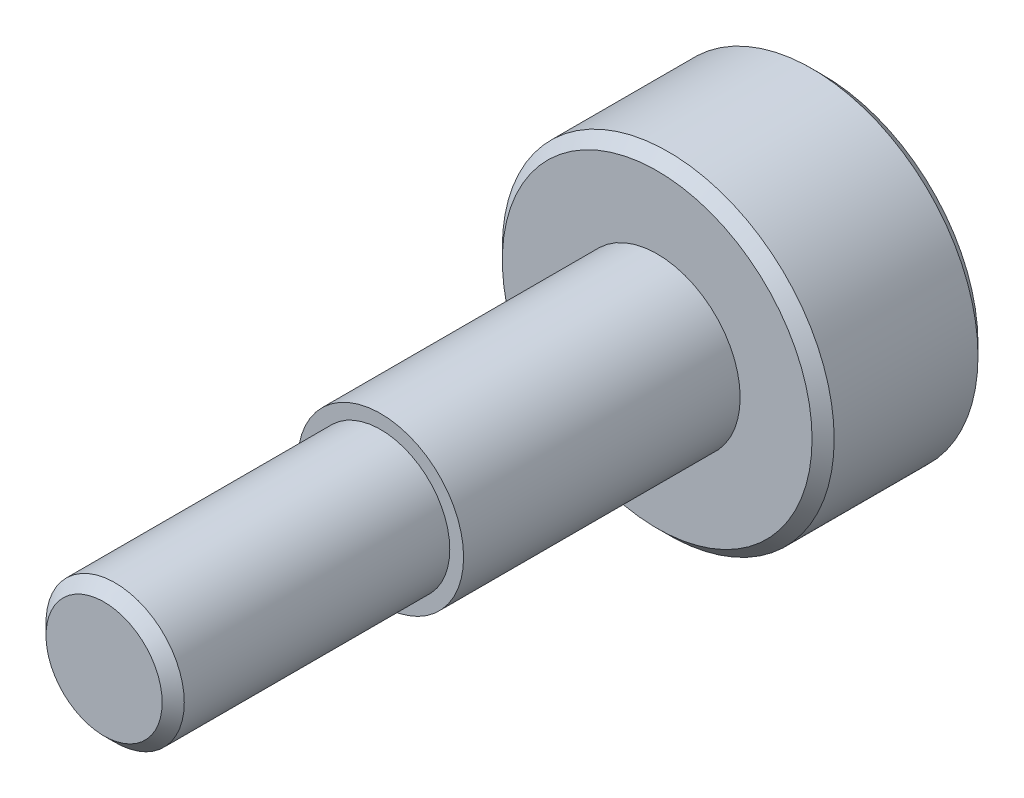
ISO-10303-21;
HEADER;
FILE_DESCRIPTION(('STEP AP214'),'2;1');
FILE_NAME('part.step','',(''),(''),'','','');
FILE_SCHEMA(('AUTOMOTIVE_DESIGN { 1 0 10303 214 1 1 1 1 }'));
ENDSEC;
DATA;
#1=APPLICATION_CONTEXT('core data for automotive mechanical design processes');
#2=APPLICATION_PROTOCOL_DEFINITION('international standard','automotive_design',2000,#1);
#3=PRODUCT_CONTEXT('',#1,'mechanical');
#4=PRODUCT('Part','Part','',(#3));
#5=PRODUCT_RELATED_PRODUCT_CATEGORY('part','',(#4));
#6=PRODUCT_DEFINITION_FORMATION('','',#4);
#7=PRODUCT_DEFINITION_CONTEXT('part definition',#1,'design');
#8=PRODUCT_DEFINITION('design','',#6,#7);
#9=PRODUCT_DEFINITION_SHAPE('','',#8);
#10=(LENGTH_UNIT() NAMED_UNIT(*) SI_UNIT(.MILLI.,.METRE.));
#11=(NAMED_UNIT(*) PLANE_ANGLE_UNIT() SI_UNIT($,.RADIAN.));
#12=(NAMED_UNIT(*) SI_UNIT($,.STERADIAN.) SOLID_ANGLE_UNIT());
#13=UNCERTAINTY_MEASURE_WITH_UNIT(LENGTH_MEASURE(1.E-05),#10,'distance_accuracy_value','');
#14=(GEOMETRIC_REPRESENTATION_CONTEXT(3) GLOBAL_UNCERTAINTY_ASSIGNED_CONTEXT((#13)) GLOBAL_UNIT_ASSIGNED_CONTEXT((#10,
#11,#12)) REPRESENTATION_CONTEXT('',''));
#15=CARTESIAN_POINT('',(0.,0.,0.));
#16=DIRECTION('',(0.,0.,1.));
#17=DIRECTION('',(1.,0.,0.));
#18=AXIS2_PLACEMENT_3D('',#15,#16,#17);
#19=CARTESIAN_POINT('',(0.,0.,3.));
#20=DIRECTION('',(0.,0.,-1.));
#21=DIRECTION('',(-1.,0.,0.));
#22=AXIS2_PLACEMENT_3D('',#19,#20,#21);
#23=CYLINDRICAL_SURFACE('',#22,3.);
#24=CARTESIAN_POINT('',(0.,0.,0.200000000000001));
#25=DIRECTION('',(0.,0.,1.));
#26=DIRECTION('',(1.,0.,0.));
#27=AXIS2_PLACEMENT_3D('',#24,#25,#26);
#28=CIRCLE('',#27,3.);
#29=CARTESIAN_POINT('',(3.,0.,0.200000000000001));
#30=VERTEX_POINT('',#29);
#31=EDGE_CURVE('E54',#30,#30,#28,.T.);
#32=ORIENTED_EDGE('',*,*,#31,.T.);
#33=EDGE_LOOP('',(#32));
#34=FACE_BOUND('',#33,.T.);
#35=CARTESIAN_POINT('',(0.,0.,2.8));
#36=DIRECTION('',(0.,0.,1.));
#37=DIRECTION('',(1.,0.,0.));
#38=AXIS2_PLACEMENT_3D('',#35,#36,#37);
#39=CIRCLE('',#38,3.);
#40=CARTESIAN_POINT('',(3.,0.,2.8));
#41=VERTEX_POINT('',#40);
#42=EDGE_CURVE('E57',#41,#41,#39,.F.);
#43=ORIENTED_EDGE('',*,*,#42,.T.);
#44=EDGE_LOOP('',(#43));
#45=FACE_BOUND('',#44,.T.);
#46=ADVANCED_FACE('F34',(#34,#45),#23,.T.);
#47=CARTESIAN_POINT('',(0.,0.,3.));
#48=DIRECTION('',(0.,0.,1.));
#49=DIRECTION('',(1.,0.,0.));
#50=AXIS2_PLACEMENT_3D('',#47,#48,#49);
#51=PLANE('',#50);
#52=CARTESIAN_POINT('',(0.,0.,3.));
#53=DIRECTION('',(0.,0.,1.));
#54=DIRECTION('',(1.,0.,0.));
#55=AXIS2_PLACEMENT_3D('',#52,#53,#54);
#56=CIRCLE('',#55,2.8);
#57=CARTESIAN_POINT('',(2.8,0.,3.));
#58=VERTEX_POINT('',#57);
#59=EDGE_CURVE('E10',#58,#58,#56,.T.);
#60=ORIENTED_EDGE('',*,*,#59,.T.);
#61=EDGE_LOOP('',(#60));
#62=FACE_BOUND('',#61,.T.);
#63=CARTESIAN_POINT('',(0.,0.,3.));
#64=DIRECTION('',(0.,0.,1.));
#65=DIRECTION('',(1.,0.,0.));
#66=AXIS2_PLACEMENT_3D('',#63,#64,#65);
#67=CIRCLE('',#66,1.5);
#68=CARTESIAN_POINT('',(1.5,0.,3.));
#69=VERTEX_POINT('',#68);
#70=EDGE_CURVE('E61',#69,#69,#67,.T.);
#71=ORIENTED_EDGE('',*,*,#70,.F.);
#72=EDGE_LOOP('',(#71));
#73=FACE_BOUND('',#72,.T.);
#74=ADVANCED_FACE('F85',(#62,#73),#51,.T.);
#75=CARTESIAN_POINT('',(0.,0.,0.));
#76=DIRECTION('',(0.,0.,1.));
#77=DIRECTION('',(1.,0.,0.));
#78=AXIS2_PLACEMENT_3D('',#75,#76,#77);
#79=PLANE('',#78);
#80=CARTESIAN_POINT('',(0.,0.,0.));
#81=DIRECTION('',(0.,0.,1.));
#82=DIRECTION('',(1.,0.,0.));
#83=AXIS2_PLACEMENT_3D('',#80,#81,#82);
#84=CIRCLE('',#83,2.8);
#85=CARTESIAN_POINT('',(2.8,0.,0.));
#86=VERTEX_POINT('',#85);
#87=EDGE_CURVE('E49',#86,#86,#84,.F.);
#88=ORIENTED_EDGE('',*,*,#87,.T.);
#89=EDGE_LOOP('',(#88));
#90=FACE_BOUND('',#89,.T.);
#91=ADVANCED_FACE('F81',(#90),#79,.F.);
#92=CARTESIAN_POINT('',(0.,0.,8.));
#93=DIRECTION('',(0.,0.,-1.));
#94=DIRECTION('',(-1.,0.,0.));
#95=AXIS2_PLACEMENT_3D('',#92,#93,#94);
#96=CYLINDRICAL_SURFACE('',#95,1.5);
#97=CARTESIAN_POINT('',(0.,0.,8.));
#98=DIRECTION('',(0.,0.,1.));
#99=DIRECTION('',(1.,0.,0.));
#100=AXIS2_PLACEMENT_3D('',#97,#98,#99);
#101=CIRCLE('',#100,1.5);
#102=CARTESIAN_POINT('',(1.5,0.,8.));
#103=VERTEX_POINT('',#102);
#104=EDGE_CURVE('E64',#103,#103,#101,.T.);
#105=ORIENTED_EDGE('',*,*,#104,.F.);
#106=EDGE_LOOP('',(#105));
#107=FACE_BOUND('',#106,.T.);
#108=ORIENTED_EDGE('',*,*,#70,.T.);
#109=EDGE_LOOP('',(#108));
#110=FACE_BOUND('',#109,.T.);
#111=ADVANCED_FACE('F75',(#107,#110),#96,.T.);
#112=CARTESIAN_POINT('',(0.,0.,8.));
#113=DIRECTION('',(0.,0.,1.));
#114=DIRECTION('',(1.,0.,0.));
#115=AXIS2_PLACEMENT_3D('',#112,#113,#114);
#116=PLANE('',#115);
#117=CARTESIAN_POINT('',(0.,0.,8.));
#118=DIRECTION('',(0.,0.,1.));
#119=DIRECTION('',(1.,0.,0.));
#120=AXIS2_PLACEMENT_3D('',#117,#118,#119);
#121=CIRCLE('',#120,1.25);
#122=CARTESIAN_POINT('',(1.25,0.,8.));
#123=VERTEX_POINT('',#122);
#124=EDGE_CURVE('E60',#123,#123,#121,.T.);
#125=ORIENTED_EDGE('',*,*,#124,.F.);
#126=EDGE_LOOP('',(#125));
#127=FACE_BOUND('',#126,.T.);
#128=ORIENTED_EDGE('',*,*,#104,.T.);
#129=EDGE_LOOP('',(#128));
#130=FACE_BOUND('',#129,.T.);
#131=ADVANCED_FACE('F72',(#127,#130),#116,.T.);
#132=CARTESIAN_POINT('',(0.,0.,13.));
#133=DIRECTION('',(0.,0.,-1.));
#134=DIRECTION('',(-1.,0.,0.));
#135=AXIS2_PLACEMENT_3D('',#132,#133,#134);
#136=CYLINDRICAL_SURFACE('',#135,1.25);
#137=CARTESIAN_POINT('',(0.,0.,12.8));
#138=DIRECTION('',(0.,0.,1.));
#139=DIRECTION('',(1.,0.,0.));
#140=AXIS2_PLACEMENT_3D('',#137,#138,#139);
#141=CIRCLE('',#140,1.25);
#142=CARTESIAN_POINT('',(1.25,0.,12.8));
#143=VERTEX_POINT('',#142);
#144=EDGE_CURVE('E41',#143,#143,#141,.F.);
#145=ORIENTED_EDGE('',*,*,#144,.T.);
#146=EDGE_LOOP('',(#145));
#147=FACE_BOUND('',#146,.T.);
#148=ORIENTED_EDGE('',*,*,#124,.T.);
#149=EDGE_LOOP('',(#148));
#150=FACE_BOUND('',#149,.T.);
#151=ADVANCED_FACE('F70',(#147,#150),#136,.T.);
#152=CARTESIAN_POINT('',(0.,0.,13.));
#153=DIRECTION('',(0.,0.,1.));
#154=DIRECTION('',(1.,0.,0.));
#155=AXIS2_PLACEMENT_3D('',#152,#153,#154);
#156=PLANE('',#155);
#157=CARTESIAN_POINT('',(0.,0.,13.));
#158=DIRECTION('',(0.,0.,1.));
#159=DIRECTION('',(1.,0.,0.));
#160=AXIS2_PLACEMENT_3D('',#157,#158,#159);
#161=CIRCLE('',#160,1.05);
#162=CARTESIAN_POINT('',(1.05,0.,13.));
#163=VERTEX_POINT('',#162);
#164=EDGE_CURVE('E45',#163,#163,#161,.T.);
#165=ORIENTED_EDGE('',*,*,#164,.T.);
#166=EDGE_LOOP('',(#165));
#167=FACE_BOUND('',#166,.T.);
#168=ADVANCED_FACE('F100',(#167),#156,.T.);
#169=CARTESIAN_POINT('',(0.,0.,0.200000000000001));
#170=DIRECTION('',(0.,0.,1.));
#171=DIRECTION('',(1.,0.,0.));
#172=AXIS2_PLACEMENT_3D('',#169,#170,#171);
#173=CONICAL_SURFACE('',#172,3.,0.785398163397448);
#174=ORIENTED_EDGE('',*,*,#87,.F.);
#175=EDGE_LOOP('',(#174));
#176=FACE_BOUND('',#175,.T.);
#177=ORIENTED_EDGE('',*,*,#31,.F.);
#178=EDGE_LOOP('',(#177));
#179=FACE_BOUND('',#178,.T.);
#180=ADVANCED_FACE('F97',(#176,#179),#173,.T.);
#181=CARTESIAN_POINT('',(0.,0.,13.));
#182=DIRECTION('',(0.,0.,-1.));
#183=DIRECTION('',(-1.,0.,0.));
#184=AXIS2_PLACEMENT_3D('',#181,#182,#183);
#185=CONICAL_SURFACE('',#184,1.05,0.785398163397446);
#186=ORIENTED_EDGE('',*,*,#144,.F.);
#187=EDGE_LOOP('',(#186));
#188=FACE_BOUND('',#187,.T.);
#189=ORIENTED_EDGE('',*,*,#164,.F.);
#190=EDGE_LOOP('',(#189));
#191=FACE_BOUND('',#190,.T.);
#192=ADVANCED_FACE('F99',(#188,#191),#185,.T.);
#193=CARTESIAN_POINT('',(0.,0.,3.));
#194=DIRECTION('',(0.,0.,-1.));
#195=DIRECTION('',(-1.,0.,0.));
#196=AXIS2_PLACEMENT_3D('',#193,#194,#195);
#197=CONICAL_SURFACE('',#196,2.8,0.78539816339745);
#198=ORIENTED_EDGE('',*,*,#42,.F.);
#199=EDGE_LOOP('',(#198));
#200=FACE_BOUND('',#199,.T.);
#201=ORIENTED_EDGE('',*,*,#59,.F.);
#202=EDGE_LOOP('',(#201));
#203=FACE_BOUND('',#202,.T.);
#204=ADVANCED_FACE('F36',(#200,#203),#197,.T.);
#205=CLOSED_SHELL('',(#46,#74,#91,#111,#131,#151,#168,#180,#192,#204));
#206=MANIFOLD_SOLID_BREP('B2',#205);
#207=ADVANCED_BREP_SHAPE_REPRESENTATION('',(#18,#206),#14);
#208=SHAPE_DEFINITION_REPRESENTATION(#9,#207);
ENDSEC;
END-ISO-10303-21;
